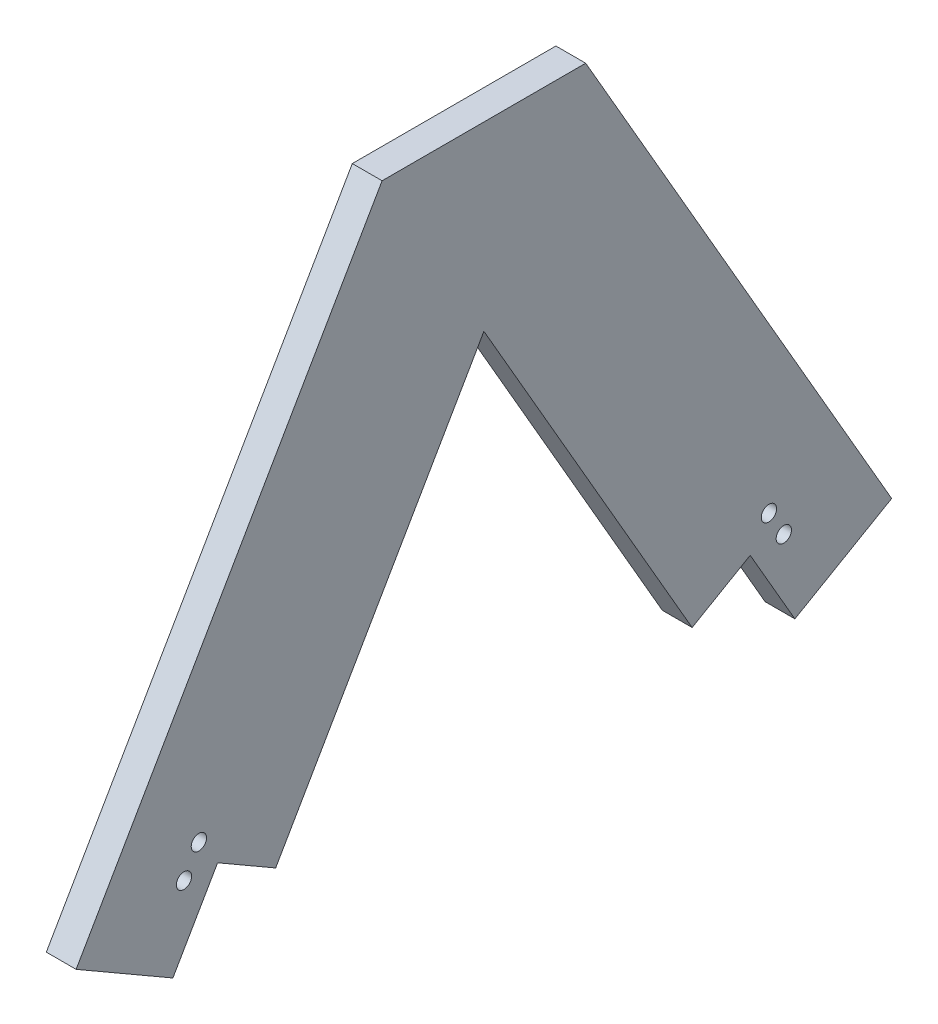
ISO-10303-21;
HEADER;
FILE_DESCRIPTION(('STEP AP214'),'2;1');
FILE_NAME('part.step','',(''),(''),'','','');
FILE_SCHEMA(('AUTOMOTIVE_DESIGN { 1 0 10303 214 1 1 1 1 }'));
ENDSEC;
DATA;
#1=APPLICATION_CONTEXT('core data for automotive mechanical design processes');
#2=APPLICATION_PROTOCOL_DEFINITION('international standard','automotive_design',2000,#1);
#3=PRODUCT_CONTEXT('',#1,'mechanical');
#4=PRODUCT('Part','Part','',(#3));
#5=PRODUCT_RELATED_PRODUCT_CATEGORY('part','',(#4));
#6=PRODUCT_DEFINITION_FORMATION('','',#4);
#7=PRODUCT_DEFINITION_CONTEXT('part definition',#1,'design');
#8=PRODUCT_DEFINITION('design','',#6,#7);
#9=PRODUCT_DEFINITION_SHAPE('','',#8);
#10=(LENGTH_UNIT() NAMED_UNIT(*) SI_UNIT(.MILLI.,.METRE.));
#11=(NAMED_UNIT(*) PLANE_ANGLE_UNIT() SI_UNIT($,.RADIAN.));
#12=(NAMED_UNIT(*) SI_UNIT($,.STERADIAN.) SOLID_ANGLE_UNIT());
#13=UNCERTAINTY_MEASURE_WITH_UNIT(LENGTH_MEASURE(1.E-05),#10,'distance_accuracy_value','');
#14=(GEOMETRIC_REPRESENTATION_CONTEXT(3) GLOBAL_UNCERTAINTY_ASSIGNED_CONTEXT((#13)) GLOBAL_UNIT_ASSIGNED_CONTEXT((#10,
#11,#12)) REPRESENTATION_CONTEXT('',''));
#15=CARTESIAN_POINT('',(0.,0.,0.));
#16=DIRECTION('',(0.,0.,1.));
#17=DIRECTION('',(1.,0.,0.));
#18=AXIS2_PLACEMENT_3D('',#15,#16,#17);
#19=CARTESIAN_POINT('',(6.35,0.,-43.9940905122494));
#20=DIRECTION('',(0.,0.499999999999996,0.866025403784441));
#21=DIRECTION('',(0.,-0.866025403784441,0.499999999999996));
#22=AXIS2_PLACEMENT_3D('',#19,#20,#21);
#23=PLANE('',#22);
#24=DIRECTION('',(0.,0.866025403784441,-0.499999999999996));
#25=VECTOR('',#24,1.);
#26=CARTESIAN_POINT('',(6.35,0.,-43.9940905122494));
#27=LINE('',#26,#25);
#28=CARTESIAN_POINT('',(6.35,16.4977839420935,-53.5190905122494));
#29=VERTEX_POINT('',#28);
#30=CARTESIAN_POINT('',(6.35,93.3557217066508,-97.8930415699754));
#31=VERTEX_POINT('',#30);
#32=EDGE_CURVE('E215',#29,#31,#27,.T.);
#33=ORIENTED_EDGE('',*,*,#32,.F.);
#34=DIRECTION('',(1.,0.,0.));
#35=VECTOR('',#34,1.);
#36=CARTESIAN_POINT('',(0.,16.4977839420935,-53.5190905122494));
#37=LINE('',#36,#35);
#38=CARTESIAN_POINT('',(0.,16.4977839420935,-53.5190905122494));
#39=VERTEX_POINT('',#38);
#40=EDGE_CURVE('E195',#39,#29,#37,.T.);
#41=ORIENTED_EDGE('',*,*,#40,.F.);
#42=DIRECTION('',(0.,0.866025403784441,-0.499999999999996));
#43=VECTOR('',#42,1.);
#44=CARTESIAN_POINT('',(0.,0.,-43.9940905122494));
#45=LINE('',#44,#43);
#46=CARTESIAN_POINT('',(0.,93.3557217066508,-97.8930415699754));
#47=VERTEX_POINT('',#46);
#48=EDGE_CURVE('E214',#39,#47,#45,.T.);
#49=ORIENTED_EDGE('',*,*,#48,.T.);
#50=DIRECTION('',(-1.,0.,0.));
#51=VECTOR('',#50,1.);
#52=CARTESIAN_POINT('',(6.35,93.3557217066508,-97.8930415699754));
#53=LINE('',#52,#51);
#54=EDGE_CURVE('E11',#31,#47,#53,.T.);
#55=ORIENTED_EDGE('',*,*,#54,.F.);
#56=EDGE_LOOP('',(#33,#41,#49,#55));
#57=FACE_BOUND('',#56,.T.);
#58=ADVANCED_FACE('F41',(#57),#23,.F.);
#59=CARTESIAN_POINT('',(6.35,93.3557217066508,-97.8930415699754));
#60=DIRECTION('',(0.,0.499999999999998,-0.86602540378444));
#61=DIRECTION('',(0.,0.86602540378444,0.499999999999998));
#62=AXIS2_PLACEMENT_3D('',#59,#60,#61);
#63=PLANE('',#62);
#64=DIRECTION('',(0.,-0.86602540378444,-0.499999999999998));
#65=VECTOR('',#64,1.);
#66=CARTESIAN_POINT('',(0.,93.3557217066508,-97.8930415699754));
#67=LINE('',#66,#65);
#68=CARTESIAN_POINT('',(0.,16.4977839420931,-142.266992627702));
#69=VERTEX_POINT('',#68);
#70=EDGE_CURVE('E236',#47,#69,#67,.T.);
#71=ORIENTED_EDGE('',*,*,#70,.T.);
#72=DIRECTION('',(1.,0.,0.));
#73=VECTOR('',#72,1.);
#74=CARTESIAN_POINT('',(0.,16.4977839420931,-142.266992627702));
#75=LINE('',#74,#73);
#76=CARTESIAN_POINT('',(6.35,16.4977839420931,-142.266992627702));
#77=VERTEX_POINT('',#76);
#78=EDGE_CURVE('E146',#69,#77,#75,.T.);
#79=ORIENTED_EDGE('',*,*,#78,.T.);
#80=DIRECTION('',(0.,-0.86602540378444,-0.499999999999998));
#81=VECTOR('',#80,1.);
#82=CARTESIAN_POINT('',(6.35,93.3557217066508,-97.8930415699754));
#83=LINE('',#82,#81);
#84=EDGE_CURVE('E218',#31,#77,#83,.T.);
#85=ORIENTED_EDGE('',*,*,#84,.F.);
#86=ORIENTED_EDGE('',*,*,#54,.T.);
#87=EDGE_LOOP('',(#71,#79,#85,#86));
#88=FACE_BOUND('',#87,.T.);
#89=ADVANCED_FACE('F276',(#88),#63,.F.);
#90=CARTESIAN_POINT('',(6.35,131.982271536748,-119.586083139952));
#91=DIRECTION('',(0.,-0.499999999999996,0.866025403784441));
#92=DIRECTION('',(0.,-0.866025403784441,-0.499999999999996));
#93=AXIS2_PLACEMENT_3D('',#90,#91,#92);
#94=PLANE('',#93);
#95=DIRECTION('',(0.,0.866025403784441,0.499999999999996));
#96=VECTOR('',#95,1.);
#97=CARTESIAN_POINT('',(6.35,131.982271536748,-119.586083139952));
#98=LINE('',#97,#96);
#99=CARTESIAN_POINT('',(6.35,19.0499999999995,-184.787560511889));
#100=VERTEX_POINT('',#99);
#101=CARTESIAN_POINT('',(6.35,131.982271536748,-119.586083139952));
#102=VERTEX_POINT('',#101);
#103=EDGE_CURVE('E223',#100,#102,#98,.T.);
#104=ORIENTED_EDGE('',*,*,#103,.F.);
#105=DIRECTION('',(1.,0.,0.));
#106=VECTOR('',#105,1.);
#107=CARTESIAN_POINT('',(0.,19.0499999999995,-184.787560511889));
#108=LINE('',#107,#106);
#109=CARTESIAN_POINT('',(0.,19.0499999999995,-184.787560511889));
#110=VERTEX_POINT('',#109);
#111=EDGE_CURVE('E180',#110,#100,#108,.T.);
#112=ORIENTED_EDGE('',*,*,#111,.F.);
#113=DIRECTION('',(0.,0.866025403784441,0.499999999999996));
#114=VECTOR('',#113,1.);
#115=CARTESIAN_POINT('',(0.,131.982271536748,-119.586083139952));
#116=LINE('',#115,#114);
#117=CARTESIAN_POINT('',(0.,131.982271536748,-119.586083139952));
#118=VERTEX_POINT('',#117);
#119=EDGE_CURVE('E239',#110,#118,#116,.T.);
#120=ORIENTED_EDGE('',*,*,#119,.T.);
#121=DIRECTION('',(-1.,0.,0.));
#122=VECTOR('',#121,1.);
#123=CARTESIAN_POINT('',(6.35,131.982271536748,-119.586083139952));
#124=LINE('',#123,#122);
#125=EDGE_CURVE('E49',#102,#118,#124,.T.);
#126=ORIENTED_EDGE('',*,*,#125,.F.);
#127=EDGE_LOOP('',(#104,#112,#120,#126));
#128=FACE_BOUND('',#127,.T.);
#129=ADVANCED_FACE('F271',(#128),#94,.F.);
#130=CARTESIAN_POINT('',(6.35,131.982271536748,-76.2));
#131=DIRECTION('',(0.,-1.,0.));
#132=DIRECTION('',(0.,0.,-1.));
#133=AXIS2_PLACEMENT_3D('',#130,#131,#132);
#134=PLANE('',#133);
#135=DIRECTION('',(0.,0.,1.));
#136=VECTOR('',#135,1.);
#137=CARTESIAN_POINT('',(0.,131.982271536748,-76.2));
#138=LINE('',#137,#136);
#139=CARTESIAN_POINT('',(0.,131.982271536748,-76.2));
#140=VERTEX_POINT('',#139);
#141=EDGE_CURVE('E242',#118,#140,#138,.T.);
#142=ORIENTED_EDGE('',*,*,#141,.T.);
#143=DIRECTION('',(-1.,0.,0.));
#144=VECTOR('',#143,1.);
#145=CARTESIAN_POINT('',(6.35,131.982271536748,-76.2));
#146=LINE('',#145,#144);
#147=CARTESIAN_POINT('',(6.35,131.982271536748,-76.2));
#148=VERTEX_POINT('',#147);
#149=EDGE_CURVE('E233',#148,#140,#146,.T.);
#150=ORIENTED_EDGE('',*,*,#149,.F.);
#151=DIRECTION('',(0.,0.,1.));
#152=VECTOR('',#151,1.);
#153=CARTESIAN_POINT('',(6.35,131.982271536748,-76.2));
#154=LINE('',#153,#152);
#155=EDGE_CURVE('E226',#102,#148,#154,.T.);
#156=ORIENTED_EDGE('',*,*,#155,.F.);
#157=ORIENTED_EDGE('',*,*,#125,.T.);
#158=EDGE_LOOP('',(#142,#150,#156,#157));
#159=FACE_BOUND('',#158,.T.);
#160=ADVANCED_FACE('F256',(#159),#134,.F.);
#161=CARTESIAN_POINT('',(6.35,0.,0.));
#162=DIRECTION('',(0.,-0.5,-0.866025403784439));
#163=DIRECTION('',(0.,0.866025403784439,-0.5));
#164=AXIS2_PLACEMENT_3D('',#161,#162,#163);
#165=PLANE('',#164);
#166=DIRECTION('',(0.,-0.866025403784439,0.5));
#167=VECTOR('',#166,1.);
#168=CARTESIAN_POINT('',(0.,0.,0.));
#169=LINE('',#168,#167);
#170=CARTESIAN_POINT('',(0.,19.0499999999999,-10.9985226280623));
#171=VERTEX_POINT('',#170);
#172=EDGE_CURVE('E219',#140,#171,#169,.T.);
#173=ORIENTED_EDGE('',*,*,#172,.T.);
#174=DIRECTION('',(1.,0.,0.));
#175=VECTOR('',#174,1.);
#176=CARTESIAN_POINT('',(0.,19.0499999999999,-10.9985226280623));
#177=LINE('',#176,#175);
#178=CARTESIAN_POINT('',(6.35,19.0499999999999,-10.9985226280623));
#179=VERTEX_POINT('',#178);
#180=EDGE_CURVE('E210',#171,#179,#177,.T.);
#181=ORIENTED_EDGE('',*,*,#180,.T.);
#182=DIRECTION('',(0.,-0.866025403784439,0.5));
#183=VECTOR('',#182,1.);
#184=CARTESIAN_POINT('',(6.35,0.,0.));
#185=LINE('',#184,#183);
#186=EDGE_CURVE('E229',#148,#179,#185,.T.);
#187=ORIENTED_EDGE('',*,*,#186,.F.);
#188=ORIENTED_EDGE('',*,*,#149,.T.);
#189=EDGE_LOOP('',(#173,#181,#187,#188));
#190=FACE_BOUND('',#189,.T.);
#191=ADVANCED_FACE('F264',(#190),#165,.F.);
#192=CARTESIAN_POINT('',(6.35,0.,0.));
#193=DIRECTION('',(1.,0.,0.));
#194=DIRECTION('',(0.,0.,-1.));
#195=AXIS2_PLACEMENT_3D('',#192,#193,#194);
#196=PLANE('',#195);
#197=CARTESIAN_POINT('',(6.35,29.4344439672293,-37.1579422993767));
#198=DIRECTION('',(-1.,0.,0.));
#199=DIRECTION('',(0.,0.,1.));
#200=AXIS2_PLACEMENT_3D('',#197,#198,#199);
#201=CIRCLE('',#200,1.63195);
#202=CARTESIAN_POINT('',(6.35,29.4344439672293,-35.5259922993767));
#203=VERTEX_POINT('',#202);
#204=EDGE_CURVE('E319',#203,#203,#201,.T.);
#205=ORIENTED_EDGE('',*,*,#204,.T.);
#206=EDGE_LOOP('',(#205));
#207=FACE_BOUND('',#206,.T.);
#208=CARTESIAN_POINT('',(6.35,23.9351826531981,-33.9829422993766));
#209=DIRECTION('',(-1.,0.,0.));
#210=DIRECTION('',(0.,0.,1.));
#211=AXIS2_PLACEMENT_3D('',#208,#209,#210);
#212=CIRCLE('',#211,1.63195);
#213=CARTESIAN_POINT('',(6.35,23.9351826531981,-32.3509922993766));
#214=VERTEX_POINT('',#213);
#215=EDGE_CURVE('E323',#214,#214,#212,.T.);
#216=ORIENTED_EDGE('',*,*,#215,.T.);
#217=EDGE_LOOP('',(#216));
#218=FACE_BOUND('',#217,.T.);
#219=CARTESIAN_POINT('',(6.35,29.4344439672295,-158.628140840577));
#220=DIRECTION('',(-1.,0.,0.));
#221=DIRECTION('',(0.,0.,1.));
#222=AXIS2_PLACEMENT_3D('',#219,#220,#221);
#223=CIRCLE('',#222,1.63195);
#224=CARTESIAN_POINT('',(6.35,29.4344439672295,-156.996190840577));
#225=VERTEX_POINT('',#224);
#226=EDGE_CURVE('E327',#225,#225,#223,.T.);
#227=ORIENTED_EDGE('',*,*,#226,.T.);
#228=EDGE_LOOP('',(#227));
#229=FACE_BOUND('',#228,.T.);
#230=CARTESIAN_POINT('',(6.35,23.9351826531983,-161.803140840577));
#231=DIRECTION('',(-1.,0.,0.));
#232=DIRECTION('',(0.,0.,1.));
#233=AXIS2_PLACEMENT_3D('',#230,#231,#232);
#234=CIRCLE('',#233,1.63195);
#235=CARTESIAN_POINT('',(6.35,23.9351826531983,-160.171190840577));
#236=VERTEX_POINT('',#235);
#237=EDGE_CURVE('E168',#236,#236,#234,.T.);
#238=ORIENTED_EDGE('',*,*,#237,.T.);
#239=EDGE_LOOP('',(#238));
#240=FACE_BOUND('',#239,.T.);
#241=DIRECTION('',(0.,-0.5,0.866025403784439));
#242=VECTOR('',#241,1.);
#243=CARTESIAN_POINT('',(6.35,23.641533942093,-154.640330584272));
#244=LINE('',#243,#242);
#245=CARTESIAN_POINT('',(6.35,23.641533942093,-154.640330584272));
#246=VERTEX_POINT('',#245);
#247=EDGE_CURVE('E163',#246,#77,#244,.T.);
#248=ORIENTED_EDGE('',*,*,#247,.F.);
#249=DIRECTION('',(0.,0.866025403784438,0.5));
#250=VECTOR('',#249,1.);
#251=CARTESIAN_POINT('',(6.35,7.14374999999946,-164.165330584272));
#252=LINE('',#251,#250);
#253=CARTESIAN_POINT('',(6.35,7.14374999999946,-164.165330584272));
#254=VERTEX_POINT('',#253);
#255=EDGE_CURVE('E142',#254,#246,#252,.T.);
#256=ORIENTED_EDGE('',*,*,#255,.F.);
#257=DIRECTION('',(0.,-0.499999999999996,0.866025403784441));
#258=VECTOR('',#257,1.);
#259=CARTESIAN_POINT('',(6.35,-3.8421819742332E-13,-151.791992627702));
#260=LINE('',#259,#258);
#261=EDGE_CURVE('E174',#100,#254,#260,.T.);
#262=ORIENTED_EDGE('',*,*,#261,.F.);
#263=ORIENTED_EDGE('',*,*,#103,.T.);
#264=ORIENTED_EDGE('',*,*,#155,.T.);
#265=ORIENTED_EDGE('',*,*,#186,.T.);
#266=DIRECTION('',(0.,0.5,0.866025403784439));
#267=VECTOR('',#266,1.);
#268=CARTESIAN_POINT('',(6.35,0.,-43.9940905122494));
#269=LINE('',#268,#267);
#270=CARTESIAN_POINT('',(6.35,7.14374999999998,-31.6207525556792));
#271=VERTEX_POINT('',#270);
#272=EDGE_CURVE('E203',#271,#179,#269,.T.);
#273=ORIENTED_EDGE('',*,*,#272,.F.);
#274=DIRECTION('',(0.,-0.866025403784439,0.5));
#275=VECTOR('',#274,1.);
#276=CARTESIAN_POINT('',(6.35,7.14374999999997,-31.6207525556792));
#277=LINE('',#276,#275);
#278=CARTESIAN_POINT('',(6.35,23.6415339420935,-41.1457525556792));
#279=VERTEX_POINT('',#278);
#280=EDGE_CURVE('E67',#279,#271,#277,.T.);
#281=ORIENTED_EDGE('',*,*,#280,.F.);
#282=DIRECTION('',(0.,0.5,0.866025403784439));
#283=VECTOR('',#282,1.);
#284=CARTESIAN_POINT('',(6.35,23.6415339420935,-41.1457525556792));
#285=LINE('',#284,#283);
#286=EDGE_CURVE('E186',#29,#279,#285,.T.);
#287=ORIENTED_EDGE('',*,*,#286,.F.);
#288=ORIENTED_EDGE('',*,*,#32,.T.);
#289=ORIENTED_EDGE('',*,*,#84,.T.);
#290=EDGE_LOOP('',(#248,#256,#262,#263,#264,#265,#273,#281,#287,#288,#289));
#291=FACE_BOUND('',#290,.T.);
#292=ADVANCED_FACE('F268',(#207,#218,#229,#240,#291),#196,.T.);
#293=CARTESIAN_POINT('',(0.,0.,0.));
#294=DIRECTION('',(1.,0.,0.));
#295=DIRECTION('',(0.,0.,-1.));
#296=AXIS2_PLACEMENT_3D('',#293,#294,#295);
#297=PLANE('',#296);
#298=CARTESIAN_POINT('',(0.,29.4344439672293,-37.1579422993767));
#299=DIRECTION('',(-1.,0.,0.));
#300=DIRECTION('',(0.,0.,1.));
#301=AXIS2_PLACEMENT_3D('',#298,#299,#300);
#302=CIRCLE('',#301,2.8575);
#303=CARTESIAN_POINT('',(0.,29.4344439672293,-34.3004422993767));
#304=VERTEX_POINT('',#303);
#305=EDGE_CURVE('E368',#304,#304,#302,.T.);
#306=ORIENTED_EDGE('',*,*,#305,.F.);
#307=EDGE_LOOP('',(#306));
#308=FACE_BOUND('',#307,.T.);
#309=CARTESIAN_POINT('',(0.,23.9351826531981,-33.9829422993766));
#310=DIRECTION('',(-1.,0.,0.));
#311=DIRECTION('',(0.,0.,1.));
#312=AXIS2_PLACEMENT_3D('',#309,#310,#311);
#313=CIRCLE('',#312,2.8575);
#314=CARTESIAN_POINT('',(0.,23.9351826531981,-31.1254422993766));
#315=VERTEX_POINT('',#314);
#316=EDGE_CURVE('E358',#315,#315,#313,.T.);
#317=ORIENTED_EDGE('',*,*,#316,.F.);
#318=EDGE_LOOP('',(#317));
#319=FACE_BOUND('',#318,.T.);
#320=CARTESIAN_POINT('',(0.,29.4344439672295,-158.628140840577));
#321=DIRECTION('',(-1.,0.,0.));
#322=DIRECTION('',(0.,0.,1.));
#323=AXIS2_PLACEMENT_3D('',#320,#321,#322);
#324=CIRCLE('',#323,2.8575);
#325=CARTESIAN_POINT('',(0.,29.4344439672295,-155.770640840577));
#326=VERTEX_POINT('',#325);
#327=EDGE_CURVE('E348',#326,#326,#324,.T.);
#328=ORIENTED_EDGE('',*,*,#327,.F.);
#329=EDGE_LOOP('',(#328));
#330=FACE_BOUND('',#329,.T.);
#331=CARTESIAN_POINT('',(0.,23.9351826531983,-161.803140840577));
#332=DIRECTION('',(-1.,0.,0.));
#333=DIRECTION('',(0.,0.,1.));
#334=AXIS2_PLACEMENT_3D('',#331,#332,#333);
#335=CIRCLE('',#334,2.8575);
#336=CARTESIAN_POINT('',(0.,23.9351826531983,-158.945640840577));
#337=VERTEX_POINT('',#336);
#338=EDGE_CURVE('E337',#337,#337,#335,.T.);
#339=ORIENTED_EDGE('',*,*,#338,.F.);
#340=EDGE_LOOP('',(#339));
#341=FACE_BOUND('',#340,.T.);
#342=DIRECTION('',(0.,0.866025403784438,0.5));
#343=VECTOR('',#342,1.);
#344=CARTESIAN_POINT('',(0.,7.14374999999946,-164.165330584272));
#345=LINE('',#344,#343);
#346=CARTESIAN_POINT('',(0.,7.14374999999959,-164.165330584272));
#347=VERTEX_POINT('',#346);
#348=CARTESIAN_POINT('',(0.,23.641533942093,-154.640330584272));
#349=VERTEX_POINT('',#348);
#350=EDGE_CURVE('E59',#347,#349,#345,.T.);
#351=ORIENTED_EDGE('',*,*,#350,.T.);
#352=DIRECTION('',(0.,-0.5,0.866025403784439));
#353=VECTOR('',#352,1.);
#354=CARTESIAN_POINT('',(0.,23.641533942093,-154.640330584272));
#355=LINE('',#354,#353);
#356=EDGE_CURVE('E150',#349,#69,#355,.T.);
#357=ORIENTED_EDGE('',*,*,#356,.T.);
#358=ORIENTED_EDGE('',*,*,#70,.F.);
#359=ORIENTED_EDGE('',*,*,#48,.F.);
#360=DIRECTION('',(0.,0.5,0.866025403784439));
#361=VECTOR('',#360,1.);
#362=CARTESIAN_POINT('',(0.,23.6415339420935,-41.1457525556792));
#363=LINE('',#362,#361);
#364=CARTESIAN_POINT('',(0.,23.6415339420935,-41.1457525556792));
#365=VERTEX_POINT('',#364);
#366=EDGE_CURVE('E187',#39,#365,#363,.T.);
#367=ORIENTED_EDGE('',*,*,#366,.T.);
#368=DIRECTION('',(0.,-0.866025403784439,0.5));
#369=VECTOR('',#368,1.);
#370=CARTESIAN_POINT('',(0.,7.14374999999997,-31.6207525556792));
#371=LINE('',#370,#369);
#372=CARTESIAN_POINT('',(0.,7.14374999999997,-31.6207525556792));
#373=VERTEX_POINT('',#372);
#374=EDGE_CURVE('E191',#365,#373,#371,.T.);
#375=ORIENTED_EDGE('',*,*,#374,.T.);
#376=DIRECTION('',(0.,0.5,0.866025403784439));
#377=VECTOR('',#376,1.);
#378=CARTESIAN_POINT('',(0.,0.,-43.9940905122494));
#379=LINE('',#378,#377);
#380=EDGE_CURVE('E208',#373,#171,#379,.T.);
#381=ORIENTED_EDGE('',*,*,#380,.T.);
#382=ORIENTED_EDGE('',*,*,#172,.F.);
#383=ORIENTED_EDGE('',*,*,#141,.F.);
#384=ORIENTED_EDGE('',*,*,#119,.F.);
#385=DIRECTION('',(0.,-0.499999999999996,0.866025403784441));
#386=VECTOR('',#385,1.);
#387=CARTESIAN_POINT('',(0.,-3.8421819742332E-13,-151.791992627702));
#388=LINE('',#387,#386);
#389=EDGE_CURVE('E161',#110,#347,#388,.T.);
#390=ORIENTED_EDGE('',*,*,#389,.T.);
#391=EDGE_LOOP('',(#351,#357,#358,#359,#367,#375,#381,#382,#383,#384,#390));
#392=FACE_BOUND('',#391,.T.);
#393=ADVANCED_FACE('F159',(#308,#319,#330,#341,#392),#297,.F.);
#394=CARTESIAN_POINT('',(0.,0.,-43.9940905122494));
#395=DIRECTION('',(0.,0.866025403784439,-0.5));
#396=DIRECTION('',(0.,0.5,0.866025403784439));
#397=AXIS2_PLACEMENT_3D('',#394,#395,#396);
#398=PLANE('',#397);
#399=ORIENTED_EDGE('',*,*,#380,.F.);
#400=DIRECTION('',(1.,0.,0.));
#401=VECTOR('',#400,1.);
#402=CARTESIAN_POINT('',(0.,7.14374999999997,-31.6207525556792));
#403=LINE('',#402,#401);
#404=EDGE_CURVE('E201',#373,#271,#403,.T.);
#405=ORIENTED_EDGE('',*,*,#404,.T.);
#406=ORIENTED_EDGE('',*,*,#272,.T.);
#407=ORIENTED_EDGE('',*,*,#180,.F.);
#408=EDGE_LOOP('',(#399,#405,#406,#407));
#409=FACE_BOUND('',#408,.T.);
#410=ADVANCED_FACE('F288',(#409),#398,.F.);
#411=CARTESIAN_POINT('',(0.,7.14374999999997,-31.6207525556792));
#412=DIRECTION('',(0.,0.5,0.866025403784439));
#413=DIRECTION('',(0.,-0.866025403784439,0.5));
#414=AXIS2_PLACEMENT_3D('',#411,#412,#413);
#415=PLANE('',#414);
#416=ORIENTED_EDGE('',*,*,#280,.T.);
#417=ORIENTED_EDGE('',*,*,#404,.F.);
#418=ORIENTED_EDGE('',*,*,#374,.F.);
#419=DIRECTION('',(1.,0.,0.));
#420=VECTOR('',#419,1.);
#421=CARTESIAN_POINT('',(0.,23.6415339420935,-41.1457525556792));
#422=LINE('',#421,#420);
#423=EDGE_CURVE('E204',#365,#279,#422,.T.);
#424=ORIENTED_EDGE('',*,*,#423,.T.);
#425=EDGE_LOOP('',(#416,#417,#418,#424));
#426=FACE_BOUND('',#425,.T.);
#427=ADVANCED_FACE('F286',(#426),#415,.F.);
#428=CARTESIAN_POINT('',(0.,23.6415339420935,-41.1457525556792));
#429=DIRECTION('',(0.,0.866025403784439,-0.5));
#430=DIRECTION('',(0.,0.5,0.866025403784439));
#431=AXIS2_PLACEMENT_3D('',#428,#429,#430);
#432=PLANE('',#431);
#433=ORIENTED_EDGE('',*,*,#286,.T.);
#434=ORIENTED_EDGE('',*,*,#423,.F.);
#435=ORIENTED_EDGE('',*,*,#366,.F.);
#436=ORIENTED_EDGE('',*,*,#40,.T.);
#437=EDGE_LOOP('',(#433,#434,#435,#436));
#438=FACE_BOUND('',#437,.T.);
#439=ADVANCED_FACE('F284',(#438),#432,.F.);
#440=CARTESIAN_POINT('',(0.,-3.8421819742332E-13,-151.791992627702));
#441=DIRECTION('',(0.,0.866025403784441,0.499999999999996));
#442=DIRECTION('',(0.,-0.499999999999996,0.866025403784441));
#443=AXIS2_PLACEMENT_3D('',#440,#441,#442);
#444=PLANE('',#443);
#445=ORIENTED_EDGE('',*,*,#261,.T.);
#446=DIRECTION('',(1.,0.,0.));
#447=VECTOR('',#446,1.);
#448=CARTESIAN_POINT('',(0.,7.14374999999946,-164.165330584272));
#449=LINE('',#448,#447);
#450=EDGE_CURVE('E147',#347,#254,#449,.T.);
#451=ORIENTED_EDGE('',*,*,#450,.F.);
#452=ORIENTED_EDGE('',*,*,#389,.F.);
#453=ORIENTED_EDGE('',*,*,#111,.T.);
#454=EDGE_LOOP('',(#445,#451,#452,#453));
#455=FACE_BOUND('',#454,.T.);
#456=ADVANCED_FACE('F273',(#455),#444,.F.);
#457=CARTESIAN_POINT('',(0.,23.641533942093,-154.640330584272));
#458=DIRECTION('',(0.,0.866025403784439,0.5));
#459=DIRECTION('',(0.,-0.5,0.866025403784439));
#460=AXIS2_PLACEMENT_3D('',#457,#458,#459);
#461=PLANE('',#460);
#462=ORIENTED_EDGE('',*,*,#247,.T.);
#463=ORIENTED_EDGE('',*,*,#78,.F.);
#464=ORIENTED_EDGE('',*,*,#356,.F.);
#465=DIRECTION('',(1.,0.,0.));
#466=VECTOR('',#465,1.);
#467=CARTESIAN_POINT('',(0.,23.641533942093,-154.640330584272));
#468=LINE('',#467,#466);
#469=EDGE_CURVE('E138',#349,#246,#468,.T.);
#470=ORIENTED_EDGE('',*,*,#469,.T.);
#471=EDGE_LOOP('',(#462,#463,#464,#470));
#472=FACE_BOUND('',#471,.T.);
#473=ADVANCED_FACE('F151',(#472),#461,.F.);
#474=CARTESIAN_POINT('',(0.,7.14374999999946,-164.165330584272));
#475=DIRECTION('',(0.,0.5,-0.866025403784438));
#476=DIRECTION('',(0.,0.866025403784439,0.5));
#477=AXIS2_PLACEMENT_3D('',#474,#475,#476);
#478=PLANE('',#477);
#479=ORIENTED_EDGE('',*,*,#255,.T.);
#480=ORIENTED_EDGE('',*,*,#469,.F.);
#481=ORIENTED_EDGE('',*,*,#350,.F.);
#482=ORIENTED_EDGE('',*,*,#450,.T.);
#483=EDGE_LOOP('',(#479,#480,#481,#482));
#484=FACE_BOUND('',#483,.T.);
#485=ADVANCED_FACE('F140',(#484),#478,.F.);
#486=CARTESIAN_POINT('',(0.,23.9351826531983,-161.803140840577));
#487=DIRECTION('',(-1.,0.,0.));
#488=DIRECTION('',(0.,0.,1.));
#489=AXIS2_PLACEMENT_3D('',#486,#487,#488);
#490=CYLINDRICAL_SURFACE('',#489,1.63195);
#491=ORIENTED_EDGE('',*,*,#237,.F.);
#492=EDGE_LOOP('',(#491));
#493=FACE_BOUND('',#492,.T.);
#494=CARTESIAN_POINT('',(1.40983400146971,23.9351826531983,-161.803140840577));
#495=DIRECTION('',(-1.,0.,0.));
#496=DIRECTION('',(0.,0.,1.));
#497=AXIS2_PLACEMENT_3D('',#494,#495,#496);
#498=CIRCLE('',#497,1.63195);
#499=CARTESIAN_POINT('',(1.40983400146971,23.9351826531983,-160.171190840577));
#500=VERTEX_POINT('',#499);
#501=EDGE_CURVE('E332',#500,#500,#498,.T.);
#502=ORIENTED_EDGE('',*,*,#501,.T.);
#503=EDGE_LOOP('',(#502));
#504=FACE_BOUND('',#503,.T.);
#505=ADVANCED_FACE('F384',(#493,#504),#490,.F.);
#506=CARTESIAN_POINT('',(0.,23.9351826531983,-161.803140840577));
#507=DIRECTION('',(-1.,0.,0.));
#508=DIRECTION('',(0.,0.,1.));
#509=AXIS2_PLACEMENT_3D('',#506,#507,#508);
#510=CONICAL_SURFACE('',#509,2.8575,0.715584993317675);
#511=ORIENTED_EDGE('',*,*,#501,.F.);
#512=EDGE_LOOP('',(#511));
#513=FACE_BOUND('',#512,.T.);
#514=ORIENTED_EDGE('',*,*,#338,.T.);
#515=EDGE_LOOP('',(#514));
#516=FACE_BOUND('',#515,.T.);
#517=ADVANCED_FACE('F381',(#513,#516),#510,.F.);
#518=CARTESIAN_POINT('',(0.,29.4344439672295,-158.628140840577));
#519=DIRECTION('',(-1.,0.,0.));
#520=DIRECTION('',(0.,0.,1.));
#521=AXIS2_PLACEMENT_3D('',#518,#519,#520);
#522=CYLINDRICAL_SURFACE('',#521,1.63194999999999);
#523=ORIENTED_EDGE('',*,*,#226,.F.);
#524=EDGE_LOOP('',(#523));
#525=FACE_BOUND('',#524,.T.);
#526=CARTESIAN_POINT('',(1.40983400146974,29.4344439672295,-158.628140840577));
#527=DIRECTION('',(-1.,0.,0.));
#528=DIRECTION('',(0.,0.,1.));
#529=AXIS2_PLACEMENT_3D('',#526,#527,#528);
#530=CIRCLE('',#529,1.63194999999999);
#531=CARTESIAN_POINT('',(1.40983400146974,29.4344439672295,-156.996190840577));
#532=VERTEX_POINT('',#531);
#533=EDGE_CURVE('E345',#532,#532,#530,.T.);
#534=ORIENTED_EDGE('',*,*,#533,.T.);
#535=EDGE_LOOP('',(#534));
#536=FACE_BOUND('',#535,.T.);
#537=ADVANCED_FACE('F383',(#525,#536),#522,.F.);
#538=CARTESIAN_POINT('',(0.,29.4344439672295,-158.628140840577));
#539=DIRECTION('',(-1.,0.,0.));
#540=DIRECTION('',(0.,0.,1.));
#541=AXIS2_PLACEMENT_3D('',#538,#539,#540);
#542=CONICAL_SURFACE('',#541,2.8575,0.715584993317666);
#543=ORIENTED_EDGE('',*,*,#533,.F.);
#544=EDGE_LOOP('',(#543));
#545=FACE_BOUND('',#544,.T.);
#546=ORIENTED_EDGE('',*,*,#327,.T.);
#547=EDGE_LOOP('',(#546));
#548=FACE_BOUND('',#547,.T.);
#549=ADVANCED_FACE('F391',(#545,#548),#542,.F.);
#550=CARTESIAN_POINT('',(0.,23.9351826531981,-33.9829422993766));
#551=DIRECTION('',(-1.,0.,0.));
#552=DIRECTION('',(0.,0.,1.));
#553=AXIS2_PLACEMENT_3D('',#550,#551,#552);
#554=CYLINDRICAL_SURFACE('',#553,1.63194999999999);
#555=ORIENTED_EDGE('',*,*,#215,.F.);
#556=EDGE_LOOP('',(#555));
#557=FACE_BOUND('',#556,.T.);
#558=CARTESIAN_POINT('',(1.40983400146974,23.9351826531981,-33.9829422993766));
#559=DIRECTION('',(-1.,0.,0.));
#560=DIRECTION('',(0.,0.,1.));
#561=AXIS2_PLACEMENT_3D('',#558,#559,#560);
#562=CIRCLE('',#561,1.63194999999999);
#563=CARTESIAN_POINT('',(1.40983400146974,23.9351826531981,-32.3509922993767));
#564=VERTEX_POINT('',#563);
#565=EDGE_CURVE('E354',#564,#564,#562,.T.);
#566=ORIENTED_EDGE('',*,*,#565,.T.);
#567=EDGE_LOOP('',(#566));
#568=FACE_BOUND('',#567,.T.);
#569=ADVANCED_FACE('F442',(#557,#568),#554,.F.);
#570=CARTESIAN_POINT('',(0.,23.9351826531981,-33.9829422993766));
#571=DIRECTION('',(-1.,0.,0.));
#572=DIRECTION('',(0.,0.,1.));
#573=AXIS2_PLACEMENT_3D('',#570,#571,#572);
#574=CONICAL_SURFACE('',#573,2.8575,0.715584993317669);
#575=ORIENTED_EDGE('',*,*,#565,.F.);
#576=EDGE_LOOP('',(#575));
#577=FACE_BOUND('',#576,.T.);
#578=ORIENTED_EDGE('',*,*,#316,.T.);
#579=EDGE_LOOP('',(#578));
#580=FACE_BOUND('',#579,.T.);
#581=ADVANCED_FACE('F461',(#577,#580),#574,.F.);
#582=CARTESIAN_POINT('',(0.,29.4344439672293,-37.1579422993767));
#583=DIRECTION('',(-1.,0.,0.));
#584=DIRECTION('',(0.,0.,1.));
#585=AXIS2_PLACEMENT_3D('',#582,#583,#584);
#586=CYLINDRICAL_SURFACE('',#585,1.63194999999999);
#587=ORIENTED_EDGE('',*,*,#204,.F.);
#588=EDGE_LOOP('',(#587));
#589=FACE_BOUND('',#588,.T.);
#590=CARTESIAN_POINT('',(1.40983400146974,29.4344439672293,-37.1579422993767));
#591=DIRECTION('',(-1.,0.,0.));
#592=DIRECTION('',(0.,0.,1.));
#593=AXIS2_PLACEMENT_3D('',#590,#591,#592);
#594=CIRCLE('',#593,1.63194999999999);
#595=CARTESIAN_POINT('',(1.40983400146974,29.4344439672293,-35.5259922993767));
#596=VERTEX_POINT('',#595);
#597=EDGE_CURVE('E364',#596,#596,#594,.T.);
#598=ORIENTED_EDGE('',*,*,#597,.T.);
#599=EDGE_LOOP('',(#598));
#600=FACE_BOUND('',#599,.T.);
#601=ADVANCED_FACE('F471',(#589,#600),#586,.F.);
#602=CARTESIAN_POINT('',(0.,29.4344439672293,-37.1579422993767));
#603=DIRECTION('',(-1.,0.,0.));
#604=DIRECTION('',(0.,0.,1.));
#605=AXIS2_PLACEMENT_3D('',#602,#603,#604);
#606=CONICAL_SURFACE('',#605,2.8575,0.715584993317666);
#607=ORIENTED_EDGE('',*,*,#597,.F.);
#608=EDGE_LOOP('',(#607));
#609=FACE_BOUND('',#608,.T.);
#610=ORIENTED_EDGE('',*,*,#305,.T.);
#611=EDGE_LOOP('',(#610));
#612=FACE_BOUND('',#611,.T.);
#613=ADVANCED_FACE('F373',(#609,#612),#606,.F.);
#614=CLOSED_SHELL('',(#58,#89,#129,#160,#191,#292,#393,#410,#427,#439,#456,#473,#485,#505,#517,
#537,#549,#569,#581,#601,#613));
#615=MANIFOLD_SOLID_BREP('B2',#614);
#616=ADVANCED_BREP_SHAPE_REPRESENTATION('',(#18,#615),#14);
#617=SHAPE_DEFINITION_REPRESENTATION(#9,#616);
ENDSEC;
END-ISO-10303-21;
